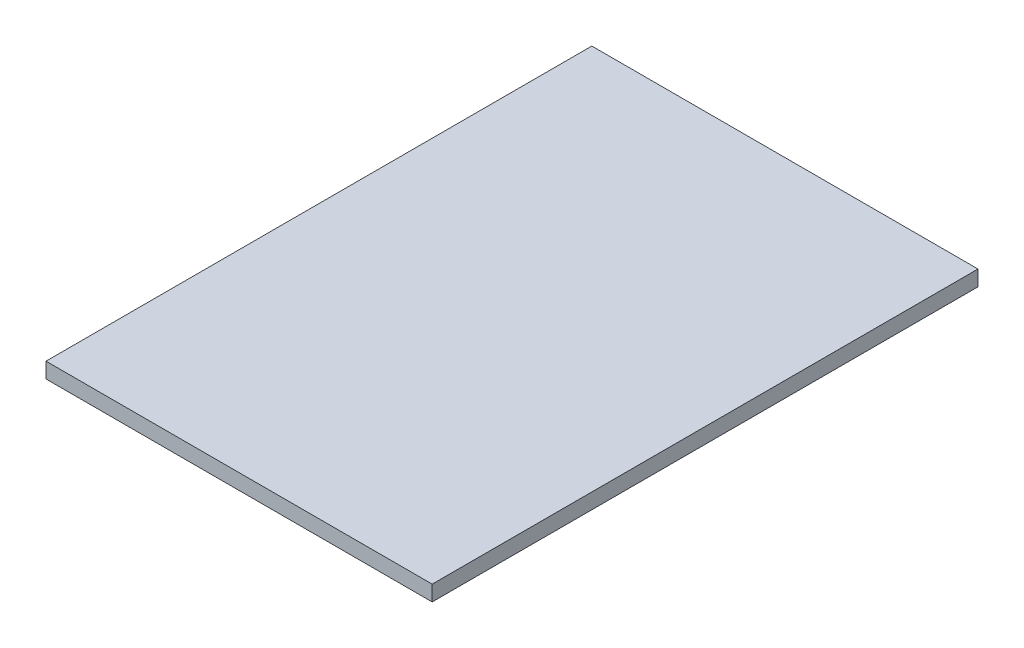
ISO-10303-21;
HEADER;
FILE_DESCRIPTION(('STEP AP214'),'2;1');
FILE_NAME('part.step','',(''),(''),'','','');
FILE_SCHEMA(('AUTOMOTIVE_DESIGN { 1 0 10303 214 1 1 1 1 }'));
ENDSEC;
DATA;
#1=APPLICATION_CONTEXT('core data for automotive mechanical design processes');
#2=APPLICATION_PROTOCOL_DEFINITION('international standard','automotive_design',2000,#1);
#3=PRODUCT_CONTEXT('',#1,'mechanical');
#4=PRODUCT('Part','Part','',(#3));
#5=PRODUCT_RELATED_PRODUCT_CATEGORY('part','',(#4));
#6=PRODUCT_DEFINITION_FORMATION('','',#4);
#7=PRODUCT_DEFINITION_CONTEXT('part definition',#1,'design');
#8=PRODUCT_DEFINITION('design','',#6,#7);
#9=PRODUCT_DEFINITION_SHAPE('','',#8);
#10=(LENGTH_UNIT() NAMED_UNIT(*) SI_UNIT(.MILLI.,.METRE.));
#11=(NAMED_UNIT(*) PLANE_ANGLE_UNIT() SI_UNIT($,.RADIAN.));
#12=(NAMED_UNIT(*) SI_UNIT($,.STERADIAN.) SOLID_ANGLE_UNIT());
#13=UNCERTAINTY_MEASURE_WITH_UNIT(LENGTH_MEASURE(1.E-05),#10,'distance_accuracy_value','');
#14=(GEOMETRIC_REPRESENTATION_CONTEXT(3) GLOBAL_UNCERTAINTY_ASSIGNED_CONTEXT((#13)) GLOBAL_UNIT_ASSIGNED_CONTEXT((#10,
#11,#12)) REPRESENTATION_CONTEXT('',''));
#15=CARTESIAN_POINT('',(0.,0.,0.));
#16=DIRECTION('',(0.,0.,1.));
#17=DIRECTION('',(1.,0.,0.));
#18=AXIS2_PLACEMENT_3D('',#15,#16,#17);
#19=CARTESIAN_POINT('',(0.,3.,0.));
#20=DIRECTION('',(1.,0.,0.));
#21=DIRECTION('',(0.,0.,-1.));
#22=AXIS2_PLACEMENT_3D('',#19,#20,#21);
#23=PLANE('',#22);
#24=DIRECTION('',(0.,0.,1.));
#25=VECTOR('',#24,1.);
#26=CARTESIAN_POINT('',(0.,0.,0.));
#27=LINE('',#26,#25);
#28=CARTESIAN_POINT('',(0.,0.,-106.));
#29=VERTEX_POINT('',#28);
#30=CARTESIAN_POINT('',(0.,0.,0.));
#31=VERTEX_POINT('',#30);
#32=EDGE_CURVE('E96',#29,#31,#27,.T.);
#33=ORIENTED_EDGE('',*,*,#32,.T.);
#34=DIRECTION('',(0.,-1.,0.));
#35=VECTOR('',#34,1.);
#36=CARTESIAN_POINT('',(0.,3.,0.));
#37=LINE('',#36,#35);
#38=CARTESIAN_POINT('',(0.,3.,0.));
#39=VERTEX_POINT('',#38);
#40=EDGE_CURVE('E11',#39,#31,#37,.T.);
#41=ORIENTED_EDGE('',*,*,#40,.F.);
#42=DIRECTION('',(0.,0.,1.));
#43=VECTOR('',#42,1.);
#44=CARTESIAN_POINT('',(0.,3.,0.));
#45=LINE('',#44,#43);
#46=CARTESIAN_POINT('',(0.,3.,-106.));
#47=VERTEX_POINT('',#46);
#48=EDGE_CURVE('E84',#47,#39,#45,.T.);
#49=ORIENTED_EDGE('',*,*,#48,.F.);
#50=DIRECTION('',(0.,-1.,0.));
#51=VECTOR('',#50,1.);
#52=CARTESIAN_POINT('',(0.,3.,-106.));
#53=LINE('',#52,#51);
#54=EDGE_CURVE('E92',#47,#29,#53,.T.);
#55=ORIENTED_EDGE('',*,*,#54,.T.);
#56=EDGE_LOOP('',(#33,#41,#49,#55));
#57=FACE_BOUND('',#56,.T.);
#58=ADVANCED_FACE('F33',(#57),#23,.F.);
#59=CARTESIAN_POINT('',(0.,3.,0.));
#60=DIRECTION('',(0.,0.,-1.));
#61=DIRECTION('',(-1.,0.,0.));
#62=AXIS2_PLACEMENT_3D('',#59,#60,#61);
#63=PLANE('',#62);
#64=DIRECTION('',(1.,0.,0.));
#65=VECTOR('',#64,1.);
#66=CARTESIAN_POINT('',(0.,0.,0.));
#67=LINE('',#66,#65);
#68=CARTESIAN_POINT('',(75.,0.,0.));
#69=VERTEX_POINT('',#68);
#70=EDGE_CURVE('E88',#31,#69,#67,.T.);
#71=ORIENTED_EDGE('',*,*,#70,.T.);
#72=DIRECTION('',(0.,-1.,0.));
#73=VECTOR('',#72,1.);
#74=CARTESIAN_POINT('',(75.,3.,0.));
#75=LINE('',#74,#73);
#76=CARTESIAN_POINT('',(75.,3.,0.));
#77=VERTEX_POINT('',#76);
#78=EDGE_CURVE('E41',#77,#69,#75,.T.);
#79=ORIENTED_EDGE('',*,*,#78,.F.);
#80=DIRECTION('',(1.,0.,0.));
#81=VECTOR('',#80,1.);
#82=CARTESIAN_POINT('',(0.,3.,0.));
#83=LINE('',#82,#81);
#84=EDGE_CURVE('E79',#39,#77,#83,.T.);
#85=ORIENTED_EDGE('',*,*,#84,.F.);
#86=ORIENTED_EDGE('',*,*,#40,.T.);
#87=EDGE_LOOP('',(#71,#79,#85,#86));
#88=FACE_BOUND('',#87,.T.);
#89=ADVANCED_FACE('F87',(#88),#63,.F.);
#90=CARTESIAN_POINT('',(75.,3.,0.));
#91=DIRECTION('',(-1.,0.,0.));
#92=DIRECTION('',(0.,0.,1.));
#93=AXIS2_PLACEMENT_3D('',#90,#91,#92);
#94=PLANE('',#93);
#95=DIRECTION('',(0.,0.,-1.));
#96=VECTOR('',#95,1.);
#97=CARTESIAN_POINT('',(75.,0.,0.));
#98=LINE('',#97,#96);
#99=CARTESIAN_POINT('',(75.,0.,-106.));
#100=VERTEX_POINT('',#99);
#101=EDGE_CURVE('E66',#69,#100,#98,.T.);
#102=ORIENTED_EDGE('',*,*,#101,.T.);
#103=DIRECTION('',(0.,-1.,0.));
#104=VECTOR('',#103,1.);
#105=CARTESIAN_POINT('',(75.,3.,-106.));
#106=LINE('',#105,#104);
#107=CARTESIAN_POINT('',(75.,3.,-106.));
#108=VERTEX_POINT('',#107);
#109=EDGE_CURVE('E89',#108,#100,#106,.T.);
#110=ORIENTED_EDGE('',*,*,#109,.F.);
#111=DIRECTION('',(0.,0.,-1.));
#112=VECTOR('',#111,1.);
#113=CARTESIAN_POINT('',(75.,3.,0.));
#114=LINE('',#113,#112);
#115=EDGE_CURVE('E82',#77,#108,#114,.T.);
#116=ORIENTED_EDGE('',*,*,#115,.F.);
#117=ORIENTED_EDGE('',*,*,#78,.T.);
#118=EDGE_LOOP('',(#102,#110,#116,#117));
#119=FACE_BOUND('',#118,.T.);
#120=ADVANCED_FACE('F90',(#119),#94,.F.);
#121=CARTESIAN_POINT('',(0.,3.,-106.));
#122=DIRECTION('',(0.,0.,1.));
#123=DIRECTION('',(1.,0.,0.));
#124=AXIS2_PLACEMENT_3D('',#121,#122,#123);
#125=PLANE('',#124);
#126=DIRECTION('',(-1.,0.,0.));
#127=VECTOR('',#126,1.);
#128=CARTESIAN_POINT('',(0.,0.,-106.));
#129=LINE('',#128,#127);
#130=EDGE_CURVE('E72',#100,#29,#129,.T.);
#131=ORIENTED_EDGE('',*,*,#130,.T.);
#132=ORIENTED_EDGE('',*,*,#54,.F.);
#133=DIRECTION('',(-1.,0.,0.));
#134=VECTOR('',#133,1.);
#135=CARTESIAN_POINT('',(0.,3.,-106.));
#136=LINE('',#135,#134);
#137=EDGE_CURVE('E49',#108,#47,#136,.T.);
#138=ORIENTED_EDGE('',*,*,#137,.F.);
#139=ORIENTED_EDGE('',*,*,#109,.T.);
#140=EDGE_LOOP('',(#131,#132,#138,#139));
#141=FACE_BOUND('',#140,.T.);
#142=ADVANCED_FACE('F103',(#141),#125,.F.);
#143=CARTESIAN_POINT('',(0.,3.,0.));
#144=DIRECTION('',(0.,-1.,0.));
#145=DIRECTION('',(0.,0.,-1.));
#146=AXIS2_PLACEMENT_3D('',#143,#144,#145);
#147=PLANE('',#146);
#148=ORIENTED_EDGE('',*,*,#48,.T.);
#149=ORIENTED_EDGE('',*,*,#84,.T.);
#150=ORIENTED_EDGE('',*,*,#115,.T.);
#151=ORIENTED_EDGE('',*,*,#137,.T.);
#152=EDGE_LOOP('',(#148,#149,#150,#151));
#153=FACE_BOUND('',#152,.T.);
#154=ADVANCED_FACE('F80',(#153),#147,.F.);
#155=CARTESIAN_POINT('',(0.,0.,0.));
#156=DIRECTION('',(0.,-1.,0.));
#157=DIRECTION('',(0.,0.,-1.));
#158=AXIS2_PLACEMENT_3D('',#155,#156,#157);
#159=PLANE('',#158);
#160=ORIENTED_EDGE('',*,*,#32,.F.);
#161=ORIENTED_EDGE('',*,*,#130,.F.);
#162=ORIENTED_EDGE('',*,*,#101,.F.);
#163=ORIENTED_EDGE('',*,*,#70,.F.);
#164=EDGE_LOOP('',(#160,#161,#162,#163));
#165=FACE_BOUND('',#164,.T.);
#166=ADVANCED_FACE('F106',(#165),#159,.T.);
#167=CLOSED_SHELL('',(#58,#89,#120,#142,#154,#166));
#168=MANIFOLD_SOLID_BREP('B2',#167);
#169=ADVANCED_BREP_SHAPE_REPRESENTATION('',(#18,#168),#14);
#170=SHAPE_DEFINITION_REPRESENTATION(#9,#169);
ENDSEC;
END-ISO-10303-21;
